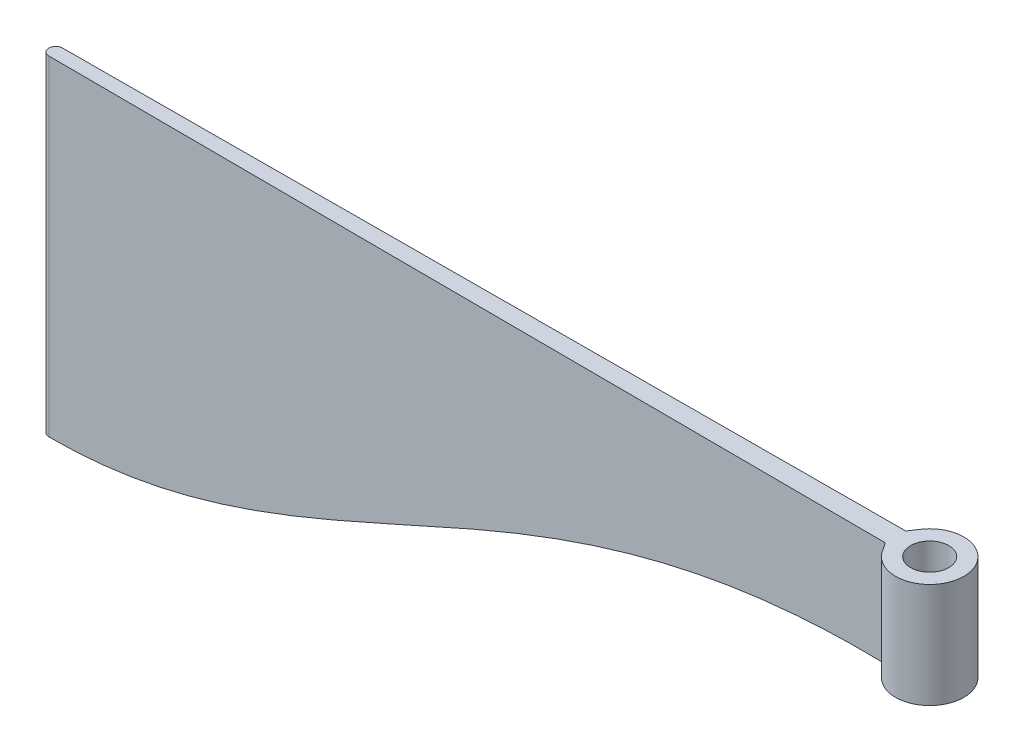
ISO-10303-21;
HEADER;
FILE_DESCRIPTION(('STEP AP214'),'2;1');
FILE_NAME('part.step','',(''),(''),'','','');
FILE_SCHEMA(('AUTOMOTIVE_DESIGN { 1 0 10303 214 1 1 1 1 }'));
ENDSEC;
DATA;
#1=APPLICATION_CONTEXT('core data for automotive mechanical design processes');
#2=APPLICATION_PROTOCOL_DEFINITION('international standard','automotive_design',2000,#1);
#3=PRODUCT_CONTEXT('',#1,'mechanical');
#4=PRODUCT('Part','Part','',(#3));
#5=PRODUCT_RELATED_PRODUCT_CATEGORY('part','',(#4));
#6=PRODUCT_DEFINITION_FORMATION('','',#4);
#7=PRODUCT_DEFINITION_CONTEXT('part definition',#1,'design');
#8=PRODUCT_DEFINITION('design','',#6,#7);
#9=PRODUCT_DEFINITION_SHAPE('','',#8);
#10=(LENGTH_UNIT() NAMED_UNIT(*) SI_UNIT(.MILLI.,.METRE.));
#11=(NAMED_UNIT(*) PLANE_ANGLE_UNIT() SI_UNIT($,.RADIAN.));
#12=(NAMED_UNIT(*) SI_UNIT($,.STERADIAN.) SOLID_ANGLE_UNIT());
#13=UNCERTAINTY_MEASURE_WITH_UNIT(LENGTH_MEASURE(1.E-05),#10,'distance_accuracy_value','');
#14=(GEOMETRIC_REPRESENTATION_CONTEXT(3) GLOBAL_UNCERTAINTY_ASSIGNED_CONTEXT((#13)) GLOBAL_UNIT_ASSIGNED_CONTEXT((#10,
#11,#12)) REPRESENTATION_CONTEXT('',''));
#15=CARTESIAN_POINT('',(0.,0.,0.));
#16=DIRECTION('',(0.,0.,1.));
#17=DIRECTION('',(1.,0.,0.));
#18=AXIS2_PLACEMENT_3D('',#15,#16,#17);
#19=CARTESIAN_POINT('',(-67.0322145617093,-18.6200596004748,3.));
#20=CARTESIAN_POINT('',(-42.7613365944057,-18.9940697978341,3.));
#21=CARTESIAN_POINT('',(-5.53549701037327,3.02928822121686,3.));
#22=CARTESIAN_POINT('',(32.3530144769874,13.9420551709255,3.));
#23=CARTESIAN_POINT('',(51.7441656265826,14.3080457982596,3.));
#24=B_SPLINE_CURVE_WITH_KNOTS('',3,(#19,#20,#21,#22,#23),.UNSPECIFIED.,.F.,.F.,(4,1,4),(0.,
0.57144369281295,1.),.UNSPECIFIED.);
#25=DIRECTION('',(0.,0.,-1.));
#26=VECTOR('',#25,1.);
#27=SURFACE_OF_LINEAR_EXTRUSION('',#24,#26);
#28=CARTESIAN_POINT('',(-67.0322145617093,-18.6200596004748,2.5));
#29=CARTESIAN_POINT('',(-66.456871869437,-18.6289345836387,2.50232127894309));
#30=CARTESIAN_POINT('',(-65.8814243670863,-18.6305371509849,2.50464298075316));
#31=CARTESIAN_POINT('',(-64.7306849996348,-18.6194279696461,2.50928575643889));
#32=CARTESIAN_POINT('',(-64.1553931301479,-18.6067166784284,2.51160683033225));
#33=CARTESIAN_POINT('',(-63.007971873431,-18.5673028364564,2.51623621876082));
#34=CARTESIAN_POINT('',(-62.4358402367749,-18.5406657284769,2.51854454237156));
#35=CARTESIAN_POINT('',(-61.2923850630205,-18.4737318982136,2.52315792923274));
#36=CARTESIAN_POINT('',(-60.7210615317302,-18.4334350782506,2.52546299245972));
#37=CARTESIAN_POINT('',(-59.0120173869275,-18.2928033991469,2.53235830587801));
#38=CARTESIAN_POINT('',(-57.8758756551076,-18.1726085886211,2.53694218590961));
#39=CARTESIAN_POINT('',(-55.61163425665,-17.8824295303677,2.54607749943822));
#40=CARTESIAN_POINT('',(-54.4835257606256,-17.7125131536897,2.5506289685583));
#41=CARTESIAN_POINT('',(-52.235561920206,-17.3264094131804,2.559698608614));
#42=CARTESIAN_POINT('',(-51.1157046947569,-17.1102329556017,2.56421678713893));
#43=CARTESIAN_POINT('',(-48.9054668373614,-16.6397714544318,2.57313421785717));
#44=CARTESIAN_POINT('',(-47.8149215664037,-16.3862552064231,2.57753413430341));
#45=CARTESIAN_POINT('',(-45.6423414841181,-15.8419074355782,2.58629963087601));
#46=CARTESIAN_POINT('',(-44.5603137887452,-15.5510476338145,2.5906651822923));
#47=CARTESIAN_POINT('',(-42.4049772055821,-14.9357980064515,2.59936110820387));
#48=CARTESIAN_POINT('',(-41.3316756361373,-14.6113826520467,2.60369145317252));
#49=CARTESIAN_POINT('',(-39.1939640991067,-13.9329047270544,2.61231626903262));
#50=CARTESIAN_POINT('',(-38.1295585497274,-13.5788282878296,2.61661072209836));
#51=CARTESIAN_POINT('',(-36.0097947872856,-12.8449853416739,2.62516312582603));
#52=CARTESIAN_POINT('',(-34.9544356766541,-12.4652214174371,2.62942108010929));
#53=CARTESIAN_POINT('',(-32.6134649471294,-11.5950025371895,2.63886596597264));
#54=CARTESIAN_POINT('',(-31.3299274917433,-11.0989796264338,2.6440445291279));
#55=CARTESIAN_POINT('',(-28.7741842094676,-10.0805795833866,2.65435593682416));
#56=CARTESIAN_POINT('',(-27.50197283367,-9.55821629890256,2.65948880375279));
#57=CARTESIAN_POINT('',(-24.9663980596017,-8.49328469984714,2.66971883953967));
#58=CARTESIAN_POINT('',(-23.7030327835513,-7.9507208379147,2.67481601597402));
#59=CARTESIAN_POINT('',(-21.18273386055,-6.85141653728628,2.68498441977722));
#60=CARTESIAN_POINT('',(-19.9257992933566,-6.29467819922311,2.69005565085889));
#61=CARTESIAN_POINT('',(-17.4102966095381,-5.17045021979238,2.70020470374451));
#62=CARTESIAN_POINT('',(-16.1517445831304,-4.60292472421438,2.70528246063083));
#63=CARTESIAN_POINT('',(-13.6357135593482,-3.46535352170166,2.71543364515807));
#64=CARTESIAN_POINT('',(-12.3782346148478,-2.89530769827176,2.72050707258567));
#65=CARTESIAN_POINT('',(-9.86134408506043,-1.75852726732807,2.73066172487782));
#66=CARTESIAN_POINT('',(-8.60193205082114,-1.19179365067567,2.7357429515537));
#67=CARTESIAN_POINT('',(-6.07809455229389,-0.0676111377454164,2.74592563210182));
#68=CARTESIAN_POINT('',(-4.81366666105241,0.489832341694031,2.75102709576585));
#69=CARTESIAN_POINT('',(-2.82332235515537,1.35235053695719,2.75905734345792));
#70=CARTESIAN_POINT('',(-2.09974955922756,1.6628266765549,2.76197667191648));
#71=CARTESIAN_POINT('',(-0.649855468413816,2.27729948274509,2.7678264179338));
#72=CARTESIAN_POINT('',(0.0764658213631927,2.58129616137469,2.77075683547194));
#73=CARTESIAN_POINT('',(1.53245083214915,3.18184168614416,2.77663115592892));
#74=CARTESIAN_POINT('',(2.26211552564905,3.47838817802846,2.77957506277137));
#75=CARTESIAN_POINT('',(3.72469919436329,4.06333873345593,2.78547600618872));
#76=CARTESIAN_POINT('',(4.45761817604342,4.35174278081288,2.78843304278972));
#77=CARTESIAN_POINT('',(6.66105470931866,5.20355220298082,2.79732303287009));
#78=CARTESIAN_POINT('',(8.13671809539628,5.75374809222874,2.80327674774506));
#79=CARTESIAN_POINT('',(11.1015692940887,6.81334222790348,2.81523874317726));
#80=CARTESIAN_POINT('',(12.5907476820585,7.32276678707247,2.8212469857098));
#81=CARTESIAN_POINT('',(15.5827864904759,8.29592432818415,2.83331867233442));
#82=CARTESIAN_POINT('',(17.0856359067185,8.7596910239728,2.83938207202891));
#83=CARTESIAN_POINT('',(20.1049330195943,9.63722589661566,2.85156373507109));
#84=CARTESIAN_POINT('',(21.6213720901293,10.0510236682861,2.8576819636159));
#85=CARTESIAN_POINT('',(24.6957668502137,10.832194806263,2.87008592375161));
#86=CARTESIAN_POINT('',(26.2539744267622,11.198579911037,2.87637267160638));
#87=CARTESIAN_POINT('',(29.3834185346835,11.8727499121984,2.88899873396687));
#88=CARTESIAN_POINT('',(30.9546579594507,12.1805214105892,2.89533806014629));
#89=CARTESIAN_POINT('',(34.1097572200559,12.7354999638828,2.90806763084453));
#90=CARTESIAN_POINT('',(35.6936300035291,12.9826334423322,2.91445792760189));
#91=CARTESIAN_POINT('',(38.8735506184997,13.4152072549743,2.92728764259326));
#92=CARTESIAN_POINT('',(40.4696181095837,13.6005039282048,2.93372714014587));
#93=CARTESIAN_POINT('',(42.8708927630632,13.8317881228271,2.94341532835884));
#94=CARTESIAN_POINT('',(43.67391346233,13.9011857368921,2.94665519751005));
#95=CARTESIAN_POINT('',(45.2811683852606,14.0243294012821,2.95313983190079));
#96=CARTESIAN_POINT('',(46.0854026135382,14.0780753919473,2.95638459715893));
#97=CARTESIAN_POINT('',(47.698409380209,14.1702534496906,2.9628924379516));
#98=CARTESIAN_POINT('',(48.5071859370515,14.2086148327936,2.96615552969896));
#99=CARTESIAN_POINT('',(50.1253166194541,14.2698757304269,2.97268404345376));
#100=CARTESIAN_POINT('',(50.9346707388841,14.2927754066926,2.97594946543646));
#101=CARTESIAN_POINT('',(51.7441656265826,14.3080457982596,2.97921545536314));
#102=B_SPLINE_CURVE_WITH_KNOTS('',3,(#28,#29,#30,#31,#32,#33,#34,#35,#36,#37,#38,#39,#40,#41,
#42,#43,#44,#45,#46,#47,#48,#49,#50,#51,#52,#53,#54,#55,#56,#57,#58,#59,#60,#61,#62,#63,#64,#65,
#66,#67,#68,#69,#70,#71,#72,#73,#74,#75,#76,#77,#78,#79,#80,#81,#82,#83,#84,#85,#86,#87,#88,#89,
#90,#91,#92,#93,#94,#95,#96,#97,#98,#99,#100,#101),.UNSPECIFIED.,.F.,.F.,(4,2,2,2,2,2,2,2,2,2,2,
2,2,2,2,2,2,2,2,2,2,2,2,2,2,2,2,2,2,2,2,2,2,2,2,2,4),(0.,1.72619014152838,3.45232511600808,
5.17042028086416,6.88852773190905,10.3147035991464,13.736224303877,17.1569392396342,
20.5151284539174,23.8758758709521,27.2391991920612,30.6041039753629,33.9686709428412,
38.0964519105611,42.2220849746772,46.3468139831909,50.4709352318513,54.6127333568762,
58.7547249693862,62.8978980323834,67.0434078368121,69.405511727437,71.7676112295171,
74.1304479972254,76.4932894616471,81.2174586345016,85.9385539466799,90.6561366276366,
95.3709114040352,100.171975608444,104.974135934442,109.782094566665,114.601146657124,
117.019082061942,119.437026683165,121.86595657225,124.294861053385),.UNSPECIFIED.);
#103=CARTESIAN_POINT('',(-66.0362491311608,-18.6281772823505,2.50401832440566));
#104=VERTEX_POINT('',#103);
#105=CARTESIAN_POINT('',(51.7441656265826,14.3080457982596,2.97921545536314));
#106=VERTEX_POINT('',#105);
#107=EDGE_CURVE('E174',#104,#106,#102,.T.);
#108=ORIENTED_EDGE('',*,*,#107,.F.);
#109=CARTESIAN_POINT('',(-66.0362491311608,-18.6281772823505,2.50401832440566));
#110=CARTESIAN_POINT('',(-66.0643823043416,-18.6281517870851,2.50390461961056));
#111=CARTESIAN_POINT('',(-66.0924971795289,-18.6281088752399,2.50260339284184));
#112=CARTESIAN_POINT('',(-66.1485161467974,-18.6279894122105,2.49763878664484));
#113=CARTESIAN_POINT('',(-66.1764202487668,-18.6279128626144,2.49397551873431));
#114=CARTESIAN_POINT('',(-66.2594675355607,-18.6276348482364,2.47947779350746));
#115=CARTESIAN_POINT('',(-66.3140398233776,-18.6273849255471,2.46513494126239));
#116=CARTESIAN_POINT('',(-66.4199996890543,-18.6267797156843,2.42749272043563));
#117=CARTESIAN_POINT('',(-66.4713857298512,-18.626424378129,2.40418906755467));
#118=CARTESIAN_POINT('',(-66.5695154713967,-18.6256447091168,2.34928709778116));
#119=CARTESIAN_POINT('',(-66.6162599910903,-18.6252203898659,2.31769024772852));
#120=CARTESIAN_POINT('',(-66.7037839121528,-18.624347127935,2.24710014090577));
#121=CARTESIAN_POINT('',(-66.7445623129148,-18.6238981811419,2.20810564595353));
#122=CARTESIAN_POINT('',(-66.8190061013958,-18.6230232615446,2.12379824911904));
#123=CARTESIAN_POINT('',(-66.8526716086442,-18.6225972883545,2.07848545343468));
#124=CARTESIAN_POINT('',(-66.8970966448949,-18.6220099912857,2.00679250589752));
#125=CARTESIAN_POINT('',(-66.9109018520328,-18.6218227000634,1.98225197694243));
#126=CARTESIAN_POINT('',(-66.9363861362889,-18.621470395252,1.93212002583981));
#127=CARTESIAN_POINT('',(-66.9480670885642,-18.6213053620484,1.90652955521582));
#128=CARTESIAN_POINT('',(-66.979799559253,-18.6208505563715,1.82842137665303));
#129=CARTESIAN_POINT('',(-66.9965724944581,-18.6206006422694,1.77451547994434));
#130=CARTESIAN_POINT('',(-67.016514372707,-18.6203001760529,1.68423133142029));
#131=CARTESIAN_POINT('',(-67.0223985123916,-18.62021035118,1.64841923666949));
#132=CARTESIAN_POINT('',(-67.0302467259305,-18.620089930531,1.57642087600608));
#133=CARTESIAN_POINT('',(-67.0322165102842,-18.6200592484757,1.54023523268926));
#134=CARTESIAN_POINT('',(-67.0322145617093,-18.6200596004748,1.50402646331411));
#135=B_SPLINE_CURVE_WITH_KNOTS('',3,(#109,#110,#111,#112,#113,#114,#115,#116,#117,#118,#119,
#120,#121,#122,#123,#124,#125,#126,#127,#128,#129,#130,#131,#132,#133,#134),.UNSPECIFIED.,.F.,
.F.,(4,2,2,2,2,2,2,2,2,2,2,2,4),(0.,0.0843483753873531,0.16869276877284,0.337102779617697,
0.505593410248477,0.674054259551075,0.842543329935026,1.01102956869946,1.09541502842351,
1.17972563257312,1.34816768602333,1.45685359271742,1.56538082506349),.UNSPECIFIED.);
#136=CARTESIAN_POINT('',(-67.0322145617093,-18.6200596004748,1.50402646331411));
#137=VERTEX_POINT('',#136);
#138=EDGE_CURVE('E42',#104,#137,#135,.T.);
#139=ORIENTED_EDGE('',*,*,#138,.T.);
#140=DIRECTION('',(0.,0.,-1.));
#141=VECTOR('',#140,1.);
#142=CARTESIAN_POINT('',(-67.0322145617093,-18.6200596004748,3.));
#143=LINE('',#142,#141);
#144=CARTESIAN_POINT('',(-67.0322145617093,-18.6200596004748,1.49597353668589));
#145=VERTEX_POINT('',#144);
#146=EDGE_CURVE('E124',#137,#145,#143,.T.);
#147=ORIENTED_EDGE('',*,*,#146,.T.);
#148=CARTESIAN_POINT('',(-67.0322145617093,-18.6200596004748,1.49597353668589));
#149=CARTESIAN_POINT('',(-67.0322143633064,-18.6200595030552,1.46784062090798));
#150=CARTESIAN_POINT('',(-67.0310266193989,-18.6200779173617,1.43972119526377));
#151=CARTESIAN_POINT('',(-67.0262882225088,-18.6201507285795,1.38368356008919));
#152=CARTESIAN_POINT('',(-67.0227376810452,-18.6202051237926,1.35576534112515));
#153=CARTESIAN_POINT('',(-67.0085755858061,-18.6204204847672,1.27266150840349));
#154=CARTESIAN_POINT('',(-66.9944534675166,-18.6206336326083,1.21803257786943));
#155=CARTESIAN_POINT('',(-66.9572401889829,-18.6211763769933,1.11192311541243));
#156=CARTESIAN_POINT('',(-66.9341447378238,-18.6215060292411,1.06044410338596));
#157=CARTESIAN_POINT('',(-66.8796407569045,-18.6222461024887,0.962094755063654));
#158=CARTESIAN_POINT('',(-66.8482336968442,-18.6226565092059,0.915223605990248));
#159=CARTESIAN_POINT('',(-66.777999289626,-18.6235140835837,0.827416181601037));
#160=CARTESIAN_POINT('',(-66.7391706752626,-18.6239612575148,0.786480921920694));
#161=CARTESIAN_POINT('',(-66.6551665639363,-18.6248448321726,0.711697627305634));
#162=CARTESIAN_POINT('',(-66.6099911726935,-18.6252812330787,0.677849474342428));
#163=CARTESIAN_POINT('',(-66.5384795210941,-18.6258930985416,0.633134905792508));
#164=CARTESIAN_POINT('',(-66.5139951014193,-18.626090080465,0.619230411330809));
#165=CARTESIAN_POINT('',(-66.4639667753678,-18.6264646653288,0.593543284180554));
#166=CARTESIAN_POINT('',(-66.4384238281079,-18.626642285305,0.581758780171931));
#167=CARTESIAN_POINT('',(-66.3604448225925,-18.6271390993154,0.549710209651963));
#168=CARTESIAN_POINT('',(-66.306607316021,-18.6274227005835,0.532719078872751));
#169=CARTESIAN_POINT('',(-66.2164021323762,-18.6277870775858,0.512411114380044));
#170=CARTESIAN_POINT('',(-66.180611565895,-18.6279041150883,0.506381677630089));
#171=CARTESIAN_POINT('',(-66.1086403163429,-18.6280828813942,0.498241886417835));
#172=CARTESIAN_POINT('',(-66.0724602790449,-18.628144690689,0.496125823644711));
#173=CARTESIAN_POINT('',(-66.0362491311608,-18.6281772823505,0.495981675594341));
#174=B_SPLINE_CURVE_WITH_KNOTS('',3,(#148,#149,#150,#151,#152,#153,#154,#155,#156,#157,#158,
#159,#160,#161,#162,#163,#164,#165,#166,#167,#168,#169,#170,#171,#172,#173),.UNSPECIFIED.,.F.,
.F.,(4,2,2,2,2,2,2,2,2,2,2,2,4),(0.,0.084346880922534,0.168689781131532,0.337096753351974,
0.50558435459909,0.674042182916289,0.842528800579524,1.01101261204785,1.09539829687553,
1.17970912482884,1.34815165433049,1.4568455874293,1.56538084680308),.UNSPECIFIED.);
#175=CARTESIAN_POINT('',(-66.0362491311608,-18.6281772823505,0.495981675594343));
#176=VERTEX_POINT('',#175);
#177=EDGE_CURVE('E49',#145,#176,#174,.T.);
#178=ORIENTED_EDGE('',*,*,#177,.T.);
#179=CARTESIAN_POINT('',(-67.0322145617093,-18.6200596004748,0.5));
#180=CARTESIAN_POINT('',(-66.456871869437,-18.6289345836387,0.497678721056914));
#181=CARTESIAN_POINT('',(-65.8814243670863,-18.6305371509849,0.495357019246845));
#182=CARTESIAN_POINT('',(-64.7306849996348,-18.6194279696461,0.490714243561112));
#183=CARTESIAN_POINT('',(-64.1553931301479,-18.6067166784284,0.488393169667752));
#184=CARTESIAN_POINT('',(-63.007971873431,-18.5673028364564,0.483763781239183));
#185=CARTESIAN_POINT('',(-62.4358402367749,-18.5406657284769,0.481455457628435));
#186=CARTESIAN_POINT('',(-61.2923850630205,-18.4737318982136,0.476842070767264));
#187=CARTESIAN_POINT('',(-60.7210615317302,-18.4334350782506,0.474537007540275));
#188=CARTESIAN_POINT('',(-59.0120173869275,-18.2928033991469,0.467641694121993));
#189=CARTESIAN_POINT('',(-57.8758756551076,-18.1726085886211,0.46305781409039));
#190=CARTESIAN_POINT('',(-55.61163425665,-17.8824295303677,0.453922500561776));
#191=CARTESIAN_POINT('',(-54.4835257606256,-17.7125131536897,0.4493710314417));
#192=CARTESIAN_POINT('',(-52.235561920206,-17.3264094131804,0.440301391386002));
#193=CARTESIAN_POINT('',(-51.1157046947569,-17.1102329556017,0.435783212861075));
#194=CARTESIAN_POINT('',(-48.9054668373614,-16.6397714544318,0.426865782142833));
#195=CARTESIAN_POINT('',(-47.8149215664037,-16.3862552064231,0.422465865696587));
#196=CARTESIAN_POINT('',(-45.6423414841181,-15.8419074355782,0.413700369123994));
#197=CARTESIAN_POINT('',(-44.5603137887452,-15.5510476338145,0.409334817707697));
#198=CARTESIAN_POINT('',(-42.4049772055821,-14.9357980064515,0.400638891796131));
#199=CARTESIAN_POINT('',(-41.3316756361373,-14.6113826520467,0.396308546827476));
#200=CARTESIAN_POINT('',(-39.1939640991067,-13.9329047270544,0.387683730967377));
#201=CARTESIAN_POINT('',(-38.1295585497274,-13.5788282878296,0.383389277901639));
#202=CARTESIAN_POINT('',(-36.0097947872856,-12.8449853416739,0.374836874173975));
#203=CARTESIAN_POINT('',(-34.9544356766541,-12.4652214174371,0.370578919890714));
#204=CARTESIAN_POINT('',(-32.6134649471294,-11.5950025371895,0.361134034027358));
#205=CARTESIAN_POINT('',(-31.3299274917433,-11.0989796264338,0.355955470872096));
#206=CARTESIAN_POINT('',(-28.7741842094676,-10.0805795833866,0.345644063175839));
#207=CARTESIAN_POINT('',(-27.50197283367,-9.55821629890256,0.340511196247208));
#208=CARTESIAN_POINT('',(-24.9663980596017,-8.49328469984714,0.330281160460327));
#209=CARTESIAN_POINT('',(-23.7030327835513,-7.9507208379147,0.325183984025982));
#210=CARTESIAN_POINT('',(-21.18273386055,-6.85141653728628,0.315015580222779));
#211=CARTESIAN_POINT('',(-19.9257992933566,-6.29467819922311,0.309944349141108));
#212=CARTESIAN_POINT('',(-17.4102966095381,-5.17045021979238,0.29979529625549));
#213=CARTESIAN_POINT('',(-16.1517445831304,-4.60292472421438,0.29471753936917));
#214=CARTESIAN_POINT('',(-13.6357135593482,-3.46535352170166,0.284566354841925));
#215=CARTESIAN_POINT('',(-12.3782346148478,-2.89530769827176,0.279492927414325));
#216=CARTESIAN_POINT('',(-9.86134408506043,-1.75852726732807,0.269338275122184));
#217=CARTESIAN_POINT('',(-8.60193205082114,-1.19179365067567,0.264257048446299));
#218=CARTESIAN_POINT('',(-6.07809455229389,-0.0676111377454164,0.25407436789818));
#219=CARTESIAN_POINT('',(-4.81366666105241,0.489832341694031,0.248972904234154));
#220=CARTESIAN_POINT('',(-2.82332235515537,1.35235053695719,0.240942656542081));
#221=CARTESIAN_POINT('',(-2.09974955922756,1.6628266765549,0.238023328083516));
#222=CARTESIAN_POINT('',(-0.649855468413816,2.27729948274509,0.2321735820662));
#223=CARTESIAN_POINT('',(0.0764658213631927,2.58129616137469,0.229243164528061));
#224=CARTESIAN_POINT('',(1.53245083214915,3.18184168614416,0.223368844071085));
#225=CARTESIAN_POINT('',(2.26211552564905,3.47838817802846,0.220424937228633));
#226=CARTESIAN_POINT('',(3.72469919436329,4.06333873345593,0.214523993811276));
#227=CARTESIAN_POINT('',(4.45761817604342,4.35174278081288,0.211566957210284));
#228=CARTESIAN_POINT('',(6.66105470931866,5.20355220298082,0.202676967129905));
#229=CARTESIAN_POINT('',(8.13671809539628,5.75374809222874,0.196723252254937));
#230=CARTESIAN_POINT('',(11.1015692940887,6.81334222790348,0.184761256822739));
#231=CARTESIAN_POINT('',(12.5907476820585,7.32276678707247,0.178753014290203));
#232=CARTESIAN_POINT('',(15.5827864904759,8.29592432818415,0.166681327665582));
#233=CARTESIAN_POINT('',(17.0856359067185,8.7596910239728,0.160617927971087));
#234=CARTESIAN_POINT('',(20.1049330195943,9.63722589661566,0.148436264928909));
#235=CARTESIAN_POINT('',(21.6213720901293,10.0510236682861,0.142318036384101));
#236=CARTESIAN_POINT('',(24.6957668502137,10.832194806263,0.129914076248388));
#237=CARTESIAN_POINT('',(26.2539744267622,11.198579911037,0.123627328393619));
#238=CARTESIAN_POINT('',(29.3834185346835,11.8727499121984,0.111001266033125));
#239=CARTESIAN_POINT('',(30.9546579594507,12.1805214105892,0.104661939853706));
#240=CARTESIAN_POINT('',(34.1097572200559,12.7354999638828,0.0919323691554748));
#241=CARTESIAN_POINT('',(35.6936300035291,12.9826334423322,0.0855420723981051));
#242=CARTESIAN_POINT('',(38.8735506184997,13.4152072549743,0.0727123574067398));
#243=CARTESIAN_POINT('',(40.4696181095837,13.6005039282048,0.0662728598541321));
#244=CARTESIAN_POINT('',(42.8708927630632,13.8317881228271,0.0565846716411643));
#245=CARTESIAN_POINT('',(43.67391346233,13.9011857368921,0.053344802489948));
#246=CARTESIAN_POINT('',(45.2811683852606,14.0243294012821,0.0468601680992064));
#247=CARTESIAN_POINT('',(46.0854026135382,14.0780753919473,0.0436154028410657));
#248=CARTESIAN_POINT('',(47.698409380209,14.1702534496906,0.0371075620484048));
#249=CARTESIAN_POINT('',(48.5071859370515,14.2086148327936,0.0338444703010396));
#250=CARTESIAN_POINT('',(50.1253166194541,14.2698757304269,0.0273159565462392));
#251=CARTESIAN_POINT('',(50.9346707388841,14.2927754066926,0.0240505345635368));
#252=CARTESIAN_POINT('',(51.7441656265826,14.3080457982596,0.0207845446368558));
#253=B_SPLINE_CURVE_WITH_KNOTS('',3,(#179,#180,#181,#182,#183,#184,#185,#186,#187,#188,#189,
#190,#191,#192,#193,#194,#195,#196,#197,#198,#199,#200,#201,#202,#203,#204,#205,#206,#207,#208,
#209,#210,#211,#212,#213,#214,#215,#216,#217,#218,#219,#220,#221,#222,#223,#224,#225,#226,#227,
#228,#229,#230,#231,#232,#233,#234,#235,#236,#237,#238,#239,#240,#241,#242,#243,#244,#245,#246,
#247,#248,#249,#250,#251,#252),.UNSPECIFIED.,.F.,.F.,(4,2,2,2,2,2,2,2,2,2,2,2,2,2,2,2,2,2,2,2,2,
2,2,2,2,2,2,2,2,2,2,2,2,2,2,2,4),(0.,1.72619014152838,3.45232511600808,5.17042028086416,
6.88852773190905,10.3147035991464,13.736224303877,17.1569392396342,20.5151284539174,
23.8758758709521,27.2391991920612,30.6041039753629,33.9686709428412,38.0964519105611,
42.2220849746772,46.3468139831909,50.4709352318513,54.6127333568762,58.7547249693862,
62.8978980323834,67.0434078368121,69.405511727437,71.7676112295171,74.1304479972254,
76.4932894616471,81.2174586345016,85.9385539466799,90.6561366276366,95.3709114040352,
100.171975608444,104.974135934442,109.782094566665,114.601146657124,117.019082061942,
119.437026683165,121.86595657225,124.294861053385),.UNSPECIFIED.);
#254=CARTESIAN_POINT('',(51.7441656265826,14.3080457982596,0.0207845446368559));
#255=VERTEX_POINT('',#254);
#256=EDGE_CURVE('E132',#176,#255,#253,.T.);
#257=ORIENTED_EDGE('',*,*,#256,.T.);
#258=DIRECTION('',(0.,0.,-1.));
#259=VECTOR('',#258,1.);
#260=CARTESIAN_POINT('',(51.7441656265826,14.3080457982596,3.));
#261=LINE('',#260,#259);
#262=EDGE_CURVE('E207',#106,#255,#261,.T.);
#263=ORIENTED_EDGE('',*,*,#262,.F.);
#264=EDGE_LOOP('',(#108,#139,#147,#178,#257,#263));
#265=FACE_BOUND('',#264,.T.);
#266=ADVANCED_FACE('F33',(#265),#27,.F.);
#267=CARTESIAN_POINT('',(51.7441656265826,14.3080457982596,3.));
#268=DIRECTION('',(0.,1.,0.));
#269=DIRECTION('',(0.,0.,1.));
#270=AXIS2_PLACEMENT_3D('',#267,#268,#269);
#271=PLANE('',#270);
#272=DIRECTION('',(0.999991861091549,0.,0.00403456945154203));
#273=VECTOR('',#272,1.);
#274=CARTESIAN_POINT('',(51.7442494825889,14.3080457982596,2.97921579368878));
#275=LINE('',#274,#273);
#276=CARTESIAN_POINT('',(56.8957377392913,14.3080457982596,3.));
#277=VERTEX_POINT('',#276);
#278=EDGE_CURVE('E114',#106,#277,#275,.T.);
#279=ORIENTED_EDGE('',*,*,#278,.F.);
#280=ORIENTED_EDGE('',*,*,#262,.T.);
#281=DIRECTION('',(0.999991861091549,0.,-0.00403456945154203));
#282=VECTOR('',#281,1.);
#283=CARTESIAN_POINT('',(51.7321458727453,14.3080457982596,0.0208330395631987));
#284=LINE('',#283,#282);
#285=CARTESIAN_POINT('',(56.8957377392913,14.3080457982596,0.));
#286=VERTEX_POINT('',#285);
#287=EDGE_CURVE('E136',#255,#286,#284,.T.);
#288=ORIENTED_EDGE('',*,*,#287,.T.);
#289=DIRECTION('',(-0.555729602506639,0.,0.831363102920627));
#290=VECTOR('',#289,1.);
#291=CARTESIAN_POINT('',(6.21195939429442,14.3080457982596,75.8221679078802));
#292=LINE('',#291,#290);
#293=CARTESIAN_POINT('',(57.9189100717425,14.3080457982596,-1.53065037617649));
#294=VERTEX_POINT('',#293);
#295=EDGE_CURVE('E146',#294,#286,#292,.T.);
#296=ORIENTED_EDGE('',*,*,#295,.F.);
#297=CARTESIAN_POINT('',(61.8957377392913,14.3080457982596,1.5));
#298=DIRECTION('',(0.,1.,0.));
#299=DIRECTION('',(0.,0.,1.));
#300=AXIS2_PLACEMENT_3D('',#297,#298,#299);
#301=CIRCLE('',#300,5.);
#302=CARTESIAN_POINT('',(57.9189100717425,14.3080457982596,4.53065037617645));
#303=VERTEX_POINT('',#302);
#304=EDGE_CURVE('E148',#294,#303,#301,.F.);
#305=ORIENTED_EDGE('',*,*,#304,.T.);
#306=DIRECTION('',(-0.555729602506635,0.,-0.83136310292063));
#307=VECTOR('',#306,1.);
#308=CARTESIAN_POINT('',(6.18955812596572,14.3080457982596,-72.8556798674078));
#309=LINE('',#308,#307);
#310=EDGE_CURVE('E139',#303,#277,#309,.T.);
#311=ORIENTED_EDGE('',*,*,#310,.T.);
#312=EDGE_LOOP('',(#279,#280,#288,#296,#305,#311));
#313=FACE_BOUND('',#312,.T.);
#314=ADVANCED_FACE('F161',(#313),#271,.F.);
#315=CARTESIAN_POINT('',(56.8957377392913,29.6602931449765,3.));
#316=DIRECTION('',(0.,-1.,0.));
#317=DIRECTION('',(0.,0.,-1.));
#318=AXIS2_PLACEMENT_3D('',#315,#316,#317);
#319=PLANE('',#318);
#320=CARTESIAN_POINT('',(61.8957377392913,29.6602931449765,1.5));
#321=DIRECTION('',(0.,1.,0.));
#322=DIRECTION('',(0.,0.,1.));
#323=AXIS2_PLACEMENT_3D('',#320,#321,#322);
#324=CIRCLE('',#323,2.8);
#325=CARTESIAN_POINT('',(61.8957377392913,29.6602931449765,4.3));
#326=VERTEX_POINT('',#325);
#327=EDGE_CURVE('E228',#326,#326,#324,.T.);
#328=ORIENTED_EDGE('',*,*,#327,.F.);
#329=EDGE_LOOP('',(#328));
#330=FACE_BOUND('',#329,.T.);
#331=DIRECTION('',(0.,0.,-1.));
#332=VECTOR('',#331,1.);
#333=CARTESIAN_POINT('',(-67.0322145617093,29.6602931449765,3.));
#334=LINE('',#333,#332);
#335=CARTESIAN_POINT('',(-67.0322145617093,29.6602931449765,1.50402646331411));
#336=VERTEX_POINT('',#335);
#337=CARTESIAN_POINT('',(-67.0322145617093,29.6602931449765,1.49597353668589));
#338=VERTEX_POINT('',#337);
#339=EDGE_CURVE('E202',#336,#338,#334,.T.);
#340=ORIENTED_EDGE('',*,*,#339,.F.);
#341=CARTESIAN_POINT('',(-66.0322145617093,29.6602931449765,1.50402646331411));
#342=DIRECTION('',(0.,-1.,0.));
#343=DIRECTION('',(0.,0.,-1.));
#344=AXIS2_PLACEMENT_3D('',#341,#342,#343);
#345=CIRCLE('',#344,1.);
#346=CARTESIAN_POINT('',(-66.0362491311608,29.6602931449765,2.50401832440566));
#347=VERTEX_POINT('',#346);
#348=EDGE_CURVE('E113',#336,#347,#345,.F.);
#349=ORIENTED_EDGE('',*,*,#348,.T.);
#350=DIRECTION('',(0.99999186109155,0.,0.00403456945154203));
#351=VECTOR('',#350,1.);
#352=CARTESIAN_POINT('',(-104.674564129198,29.6602931449765,2.34812809027917));
#353=LINE('',#352,#351);
#354=CARTESIAN_POINT('',(56.8957377392913,29.6602931449765,3.00000000000003));
#355=VERTEX_POINT('',#354);
#356=EDGE_CURVE('E106',#347,#355,#353,.T.);
#357=ORIENTED_EDGE('',*,*,#356,.T.);
#358=DIRECTION('',(0.555729602506635,0.,0.83136310292063));
#359=VECTOR('',#358,1.);
#360=CARTESIAN_POINT('',(6.18955812596572,29.6602931449765,-72.8556798674078));
#361=LINE('',#360,#359);
#362=CARTESIAN_POINT('',(57.9189100717425,29.6602931449765,4.53065037617645));
#363=VERTEX_POINT('',#362);
#364=EDGE_CURVE('E112',#355,#363,#361,.T.);
#365=ORIENTED_EDGE('',*,*,#364,.T.);
#366=CARTESIAN_POINT('',(61.8957377392913,29.6602931449765,1.5));
#367=DIRECTION('',(0.,1.,0.));
#368=DIRECTION('',(0.,0.,1.));
#369=AXIS2_PLACEMENT_3D('',#366,#367,#368);
#370=CIRCLE('',#369,5.);
#371=CARTESIAN_POINT('',(57.9189100717425,29.6602931449765,-1.53065037617649));
#372=VERTEX_POINT('',#371);
#373=EDGE_CURVE('E131',#363,#372,#370,.T.);
#374=ORIENTED_EDGE('',*,*,#373,.T.);
#375=DIRECTION('',(0.555729602506639,0.,-0.831363102920627));
#376=VECTOR('',#375,1.);
#377=CARTESIAN_POINT('',(6.21195939429442,29.6602931449765,75.8221679078802));
#378=LINE('',#377,#376);
#379=CARTESIAN_POINT('',(56.8957377392913,29.6602931449765,0.));
#380=VERTEX_POINT('',#379);
#381=EDGE_CURVE('E134',#380,#372,#378,.T.);
#382=ORIENTED_EDGE('',*,*,#381,.F.);
#383=DIRECTION('',(0.99999186109155,0.,-0.00403456945154203));
#384=VECTOR('',#383,1.);
#385=CARTESIAN_POINT('',(-104.674564129198,29.6602931449765,0.651871909720827));
#386=LINE('',#385,#384);
#387=CARTESIAN_POINT('',(-66.0362491311608,29.6602931449765,0.495981675594343));
#388=VERTEX_POINT('',#387);
#389=EDGE_CURVE('E222',#388,#380,#386,.T.);
#390=ORIENTED_EDGE('',*,*,#389,.F.);
#391=CARTESIAN_POINT('',(-66.0322145617093,29.6602931449765,1.49597353668589));
#392=DIRECTION('',(0.,-1.,0.));
#393=DIRECTION('',(0.,0.,-1.));
#394=AXIS2_PLACEMENT_3D('',#391,#392,#393);
#395=CIRCLE('',#394,1.);
#396=EDGE_CURVE('E204',#388,#338,#395,.F.);
#397=ORIENTED_EDGE('',*,*,#396,.T.);
#398=EDGE_LOOP('',(#340,#349,#357,#365,#374,#382,#390,#397));
#399=FACE_BOUND('',#398,.T.);
#400=ADVANCED_FACE('F109',(#330,#399),#319,.F.);
#401=CARTESIAN_POINT('',(-67.0322145617093,29.6602931449765,3.));
#402=DIRECTION('',(1.,0.,0.));
#403=DIRECTION('',(0.,0.,-1.));
#404=AXIS2_PLACEMENT_3D('',#401,#402,#403);
#405=PLANE('',#404);
#406=ORIENTED_EDGE('',*,*,#146,.F.);
#407=DIRECTION('',(0.,1.,0.));
#408=VECTOR('',#407,1.);
#409=CARTESIAN_POINT('',(-67.0322145617093,29.6602931449765,1.50402646331411));
#410=LINE('',#409,#408);
#411=EDGE_CURVE('E199',#137,#336,#410,.T.);
#412=ORIENTED_EDGE('',*,*,#411,.T.);
#413=ORIENTED_EDGE('',*,*,#339,.T.);
#414=DIRECTION('',(0.,1.,0.));
#415=VECTOR('',#414,1.);
#416=CARTESIAN_POINT('',(-67.0322145617093,29.6602931449765,1.49597353668589));
#417=LINE('',#416,#415);
#418=EDGE_CURVE('E201',#338,#145,#417,.F.);
#419=ORIENTED_EDGE('',*,*,#418,.T.);
#420=EDGE_LOOP('',(#406,#412,#413,#419));
#421=FACE_BOUND('',#420,.T.);
#422=ADVANCED_FACE('F197',(#421),#405,.F.);
#423=CARTESIAN_POINT('',(6.18955812596572,0.165910174528619,-72.8556798674078));
#424=DIRECTION('',(-0.831363102920629,0.,0.555729602506635));
#425=DIRECTION('',(0.555729602506635,0.,0.83136310292063));
#426=AXIS2_PLACEMENT_3D('',#423,#424,#425);
#427=PLANE('',#426);
#428=ORIENTED_EDGE('',*,*,#310,.F.);
#429=DIRECTION('',(0.,1.,0.));
#430=VECTOR('',#429,1.);
#431=CARTESIAN_POINT('',(57.9189100717425,0.165910174528619,4.53065037617645));
#432=LINE('',#431,#430);
#433=EDGE_CURVE('E129',#303,#363,#432,.T.);
#434=ORIENTED_EDGE('',*,*,#433,.T.);
#435=ORIENTED_EDGE('',*,*,#364,.F.);
#436=DIRECTION('',(0.,1.,0.));
#437=VECTOR('',#436,1.);
#438=CARTESIAN_POINT('',(56.8957377392913,14.3080457982596,3.));
#439=LINE('',#438,#437);
#440=EDGE_CURVE('E118',#277,#355,#439,.T.);
#441=ORIENTED_EDGE('',*,*,#440,.F.);
#442=EDGE_LOOP('',(#428,#434,#435,#441));
#443=FACE_BOUND('',#442,.T.);
#444=ADVANCED_FACE('F127',(#443),#427,.T.);
#445=CARTESIAN_POINT('',(6.21195939429442,0.165910174528619,75.8221679078802));
#446=DIRECTION('',(0.831363102920627,0.,0.555729602506639));
#447=DIRECTION('',(0.555729602506639,0.,-0.831363102920627));
#448=AXIS2_PLACEMENT_3D('',#445,#446,#447);
#449=PLANE('',#448);
#450=DIRECTION('',(0.,1.,0.));
#451=VECTOR('',#450,1.);
#452=CARTESIAN_POINT('',(57.9189100717425,0.165910174528619,-1.53065037617649));
#453=LINE('',#452,#451);
#454=EDGE_CURVE('E144',#294,#372,#453,.T.);
#455=ORIENTED_EDGE('',*,*,#454,.F.);
#456=ORIENTED_EDGE('',*,*,#295,.T.);
#457=DIRECTION('',(0.,1.,0.));
#458=VECTOR('',#457,1.);
#459=CARTESIAN_POINT('',(56.8957377392913,14.3080457982596,0.));
#460=LINE('',#459,#458);
#461=EDGE_CURVE('E125',#286,#380,#460,.T.);
#462=ORIENTED_EDGE('',*,*,#461,.T.);
#463=ORIENTED_EDGE('',*,*,#381,.T.);
#464=EDGE_LOOP('',(#455,#456,#462,#463));
#465=FACE_BOUND('',#464,.T.);
#466=ADVANCED_FACE('F217',(#465),#449,.F.);
#467=CARTESIAN_POINT('',(61.8957377392913,0.165910174528619,1.5));
#468=DIRECTION('',(0.,1.,0.));
#469=DIRECTION('',(0.,0.,1.));
#470=AXIS2_PLACEMENT_3D('',#467,#468,#469);
#471=CYLINDRICAL_SURFACE('',#470,5.);
#472=ORIENTED_EDGE('',*,*,#304,.F.);
#473=ORIENTED_EDGE('',*,*,#454,.T.);
#474=ORIENTED_EDGE('',*,*,#373,.F.);
#475=ORIENTED_EDGE('',*,*,#433,.F.);
#476=EDGE_LOOP('',(#472,#473,#474,#475));
#477=FACE_BOUND('',#476,.T.);
#478=ADVANCED_FACE('F225',(#477),#471,.T.);
#479=CARTESIAN_POINT('',(-104.674564129198,-18.9940697978341,0.651871909720827));
#480=DIRECTION('',(0.00403456945154203,0.,0.999991861091549));
#481=DIRECTION('',(0.999991861091549,0.,-0.00403456945154203));
#482=AXIS2_PLACEMENT_3D('',#479,#480,#481);
#483=PLANE('',#482);
#484=ORIENTED_EDGE('',*,*,#256,.F.);
#485=DIRECTION('',(0.,1.,0.));
#486=VECTOR('',#485,1.);
#487=CARTESIAN_POINT('',(-66.0362491311608,-18.9940697978341,0.495981675594343));
#488=LINE('',#487,#486);
#489=EDGE_CURVE('E11',#176,#388,#488,.T.);
#490=ORIENTED_EDGE('',*,*,#489,.T.);
#491=ORIENTED_EDGE('',*,*,#389,.T.);
#492=ORIENTED_EDGE('',*,*,#461,.F.);
#493=ORIENTED_EDGE('',*,*,#287,.F.);
#494=EDGE_LOOP('',(#484,#490,#491,#492,#493));
#495=FACE_BOUND('',#494,.T.);
#496=ADVANCED_FACE('F253',(#495),#483,.F.);
#497=CARTESIAN_POINT('',(-104.674564129198,-18.9940697978341,2.34812809027917));
#498=DIRECTION('',(-0.00403456945154203,0.,0.999991861091549));
#499=DIRECTION('',(0.999991861091549,0.,0.00403456945154203));
#500=AXIS2_PLACEMENT_3D('',#497,#498,#499);
#501=PLANE('',#500);
#502=ORIENTED_EDGE('',*,*,#356,.F.);
#503=DIRECTION('',(0.,1.,0.));
#504=VECTOR('',#503,1.);
#505=CARTESIAN_POINT('',(-66.0362491311608,-18.6200596004748,2.50401832440566));
#506=LINE('',#505,#504);
#507=EDGE_CURVE('E57',#347,#104,#506,.F.);
#508=ORIENTED_EDGE('',*,*,#507,.T.);
#509=ORIENTED_EDGE('',*,*,#107,.T.);
#510=ORIENTED_EDGE('',*,*,#278,.T.);
#511=ORIENTED_EDGE('',*,*,#440,.T.);
#512=EDGE_LOOP('',(#502,#508,#509,#510,#511));
#513=FACE_BOUND('',#512,.T.);
#514=ADVANCED_FACE('F119',(#513),#501,.T.);
#515=CARTESIAN_POINT('',(-66.0322145617093,29.6602931449765,1.50402646331411));
#516=DIRECTION('',(0.,-1.,0.));
#517=DIRECTION('',(0.,0.,-1.));
#518=AXIS2_PLACEMENT_3D('',#515,#516,#517);
#519=CYLINDRICAL_SURFACE('',#518,1.);
#520=ORIENTED_EDGE('',*,*,#138,.F.);
#521=ORIENTED_EDGE('',*,*,#507,.F.);
#522=ORIENTED_EDGE('',*,*,#348,.F.);
#523=ORIENTED_EDGE('',*,*,#411,.F.);
#524=EDGE_LOOP('',(#520,#521,#522,#523));
#525=FACE_BOUND('',#524,.T.);
#526=ADVANCED_FACE('F163',(#525),#519,.T.);
#527=CARTESIAN_POINT('',(-66.0322145617093,-18.9940697978341,1.49597353668589));
#528=DIRECTION('',(0.,1.,0.));
#529=DIRECTION('',(0.,0.,1.));
#530=AXIS2_PLACEMENT_3D('',#527,#528,#529);
#531=CYLINDRICAL_SURFACE('',#530,1.);
#532=ORIENTED_EDGE('',*,*,#177,.F.);
#533=ORIENTED_EDGE('',*,*,#418,.F.);
#534=ORIENTED_EDGE('',*,*,#396,.F.);
#535=ORIENTED_EDGE('',*,*,#489,.F.);
#536=EDGE_LOOP('',(#532,#533,#534,#535));
#537=FACE_BOUND('',#536,.T.);
#538=ADVANCED_FACE('F35',(#537),#531,.T.);
#539=CARTESIAN_POINT('',(61.8957377392913,16.6602931449766,1.5));
#540=DIRECTION('',(0.,1.,0.));
#541=DIRECTION('',(0.,0.,1.));
#542=AXIS2_PLACEMENT_3D('',#539,#540,#541);
#543=CYLINDRICAL_SURFACE('',#542,2.8);
#544=CARTESIAN_POINT('',(61.8957377392913,16.6602931449766,1.5));
#545=DIRECTION('',(0.,1.,0.));
#546=DIRECTION('',(0.,0.,1.));
#547=AXIS2_PLACEMENT_3D('',#544,#545,#546);
#548=CIRCLE('',#547,2.8);
#549=CARTESIAN_POINT('',(61.8957377392913,16.6602931449765,4.3));
#550=VERTEX_POINT('',#549);
#551=EDGE_CURVE('E115',#550,#550,#548,.T.);
#552=CARTESIAN_POINT('',(61.8957377392913,16.6602931449765,4.3));
#553=CARTESIAN_POINT('',(61.8957377392913,16.7957098116432,4.3));
#554=CARTESIAN_POINT('',(61.8957377392913,16.9311264783099,4.3));
#555=CARTESIAN_POINT('',(61.8957377392913,17.2019598116432,4.3));
#556=CARTESIAN_POINT('',(61.8957377392913,17.3373764783099,4.3));
#557=CARTESIAN_POINT('',(61.8957377392913,17.6082098116432,4.3));
#558=CARTESIAN_POINT('',(61.8957377392913,17.7436264783099,4.3));
#559=CARTESIAN_POINT('',(61.8957377392913,18.0144598116432,4.3));
#560=CARTESIAN_POINT('',(61.8957377392913,18.1498764783099,4.3));
#561=CARTESIAN_POINT('',(61.8957377392913,18.4207098116432,4.3));
#562=CARTESIAN_POINT('',(61.8957377392913,18.5561264783099,4.3));
#563=CARTESIAN_POINT('',(61.8957377392913,18.8269598116432,4.3));
#564=CARTESIAN_POINT('',(61.8957377392913,18.9623764783099,4.3));
#565=CARTESIAN_POINT('',(61.8957377392913,19.2332098116432,4.3));
#566=CARTESIAN_POINT('',(61.8957377392913,19.3686264783099,4.3));
#567=CARTESIAN_POINT('',(61.8957377392913,19.6394598116432,4.3));
#568=CARTESIAN_POINT('',(61.8957377392913,19.7748764783099,4.3));
#569=CARTESIAN_POINT('',(61.8957377392913,20.0457098116432,4.3));
#570=CARTESIAN_POINT('',(61.8957377392913,20.1811264783099,4.3));
#571=CARTESIAN_POINT('',(61.8957377392913,20.4519598116432,4.3));
#572=CARTESIAN_POINT('',(61.8957377392913,20.5873764783099,4.3));
#573=CARTESIAN_POINT('',(61.8957377392913,20.8582098116432,4.3));
#574=CARTESIAN_POINT('',(61.8957377392913,20.9936264783099,4.3));
#575=CARTESIAN_POINT('',(61.8957377392913,21.2644598116432,4.3));
#576=CARTESIAN_POINT('',(61.8957377392913,21.3998764783099,4.3));
#577=CARTESIAN_POINT('',(61.8957377392913,21.6707098116432,4.3));
#578=CARTESIAN_POINT('',(61.8957377392913,21.8061264783099,4.3));
#579=CARTESIAN_POINT('',(61.8957377392913,22.0769598116432,4.3));
#580=CARTESIAN_POINT('',(61.8957377392913,22.2123764783099,4.3));
#581=CARTESIAN_POINT('',(61.8957377392913,22.4832098116432,4.3));
#582=CARTESIAN_POINT('',(61.8957377392913,22.6186264783099,4.3));
#583=CARTESIAN_POINT('',(61.8957377392913,22.8894598116432,4.3));
#584=CARTESIAN_POINT('',(61.8957377392913,23.0248764783099,4.3));
#585=CARTESIAN_POINT('',(61.8957377392913,23.2957098116432,4.3));
#586=CARTESIAN_POINT('',(61.8957377392913,23.4311264783099,4.3));
#587=CARTESIAN_POINT('',(61.8957377392913,23.7019598116432,4.3));
#588=CARTESIAN_POINT('',(61.8957377392913,23.8373764783099,4.3));
#589=CARTESIAN_POINT('',(61.8957377392913,24.1082098116432,4.3));
#590=CARTESIAN_POINT('',(61.8957377392913,24.2436264783099,4.3));
#591=CARTESIAN_POINT('',(61.8957377392913,24.5144598116432,4.3));
#592=CARTESIAN_POINT('',(61.8957377392913,24.6498764783099,4.3));
#593=CARTESIAN_POINT('',(61.8957377392913,24.9207098116432,4.3));
#594=CARTESIAN_POINT('',(61.8957377392913,25.0561264783099,4.3));
#595=CARTESIAN_POINT('',(61.8957377392913,25.3269598116432,4.3));
#596=CARTESIAN_POINT('',(61.8957377392913,25.4623764783099,4.3));
#597=CARTESIAN_POINT('',(61.8957377392913,25.7332098116432,4.3));
#598=CARTESIAN_POINT('',(61.8957377392913,25.8686264783099,4.3));
#599=CARTESIAN_POINT('',(61.8957377392913,26.1394598116432,4.3));
#600=CARTESIAN_POINT('',(61.8957377392913,26.2748764783099,4.3));
#601=CARTESIAN_POINT('',(61.8957377392913,26.5457098116432,4.3));
#602=CARTESIAN_POINT('',(61.8957377392913,26.6811264783099,4.3));
#603=CARTESIAN_POINT('',(61.8957377392913,26.9519598116432,4.3));
#604=CARTESIAN_POINT('',(61.8957377392913,27.0873764783099,4.3));
#605=CARTESIAN_POINT('',(61.8957377392913,27.3582098116432,4.3));
#606=CARTESIAN_POINT('',(61.8957377392913,27.4936264783099,4.3));
#607=CARTESIAN_POINT('',(61.8957377392913,27.7644598116432,4.3));
#608=CARTESIAN_POINT('',(61.8957377392913,27.8998764783099,4.3));
#609=CARTESIAN_POINT('',(61.8957377392913,28.1707098116432,4.3));
#610=CARTESIAN_POINT('',(61.8957377392913,28.3061264783099,4.3));
#611=CARTESIAN_POINT('',(61.8957377392913,28.5769598116432,4.3));
#612=CARTESIAN_POINT('',(61.8957377392913,28.7123764783099,4.3));
#613=CARTESIAN_POINT('',(61.8957377392913,28.9832098116432,4.3));
#614=CARTESIAN_POINT('',(61.8957377392913,29.1186264783099,4.3));
#615=CARTESIAN_POINT('',(61.8957377392913,29.3894598116432,4.3));
#616=CARTESIAN_POINT('',(61.8957377392913,29.5248764783099,4.3));
#617=CARTESIAN_POINT('',(61.8957377392913,29.6602931449765,4.3));
#618=B_SPLINE_CURVE_WITH_KNOTS('',3,(#552,#553,#554,#555,#556,#557,#558,#559,#560,#561,#562,
#563,#564,#565,#566,#567,#568,#569,#570,#571,#572,#573,#574,#575,#576,#577,#578,#579,#580,#581,
#582,#583,#584,#585,#586,#587,#588,#589,#590,#591,#592,#593,#594,#595,#596,#597,#598,#599,#600,
#601,#602,#603,#604,#605,#606,#607,#608,#609,#610,#611,#612,#613,#614,#615,#616,#617),
.UNSPECIFIED.,.F.,.F.,(4,2,2,2,2,2,2,2,2,2,2,2,2,2,2,2,2,2,2,2,2,2,2,2,2,2,2,2,2,2,2,2,4),(0.,
0.40625,0.812500000000001,1.21875,1.625,2.03125,2.4375,2.84375,3.25,3.65625,4.0625,4.46875,
4.875,5.28125,5.6875,6.09375,6.5,6.90625,7.3125,7.71875,8.125,8.53125,8.9375,9.34375,9.75,
10.15625,10.5625,10.96875,11.375,11.78125,12.1875,12.59375,13.),.UNSPECIFIED.);
#619=EDGE_CURVE('BSEAM236',#550,#326,#618,.T.);
#620=ORIENTED_EDGE('',*,*,#551,.F.);
#621=ORIENTED_EDGE('',*,*,#327,.T.);
#622=ORIENTED_EDGE('',*,*,#619,.T.);
#623=ORIENTED_EDGE('',*,*,#619,.F.);
#624=EDGE_LOOP('',(#620,#622,#621,#623));
#625=FACE_BOUND('',#624,.T.);
#626=ADVANCED_FACE('F236',(#625),#543,.F.);
#627=CARTESIAN_POINT('',(-105.304528441833,16.6602931449766,0.112596469158166));
#628=DIRECTION('',(0.,1.,0.));
#629=DIRECTION('',(0.,0.,1.));
#630=AXIS2_PLACEMENT_3D('',#627,#628,#629);
#631=PLANE('',#630);
#632=ORIENTED_EDGE('',*,*,#551,.T.);
#633=EDGE_LOOP('',(#632));
#634=FACE_BOUND('',#633,.T.);
#635=ADVANCED_FACE('F234',(#634),#631,.T.);
#636=CLOSED_SHELL('',(#266,#314,#400,#422,#444,#466,#478,#496,#514,#526,#538,#626,#635));
#637=MANIFOLD_SOLID_BREP('B2',#636);
#638=ADVANCED_BREP_SHAPE_REPRESENTATION('',(#18,#637),#14);
#639=SHAPE_DEFINITION_REPRESENTATION(#9,#638);
ENDSEC;
END-ISO-10303-21;
